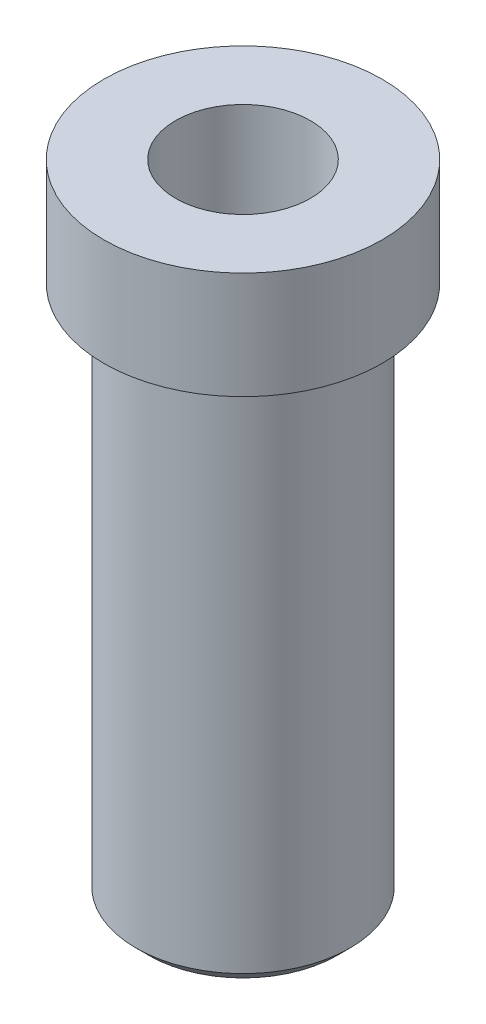
ISO-10303-21;
HEADER;
FILE_DESCRIPTION(('STEP AP214'),'2;1');
FILE_NAME('part.step','',(''),(''),'','','');
FILE_SCHEMA(('AUTOMOTIVE_DESIGN { 1 0 10303 214 1 1 1 1 }'));
ENDSEC;
DATA;
#1=APPLICATION_CONTEXT('core data for automotive mechanical design processes');
#2=APPLICATION_PROTOCOL_DEFINITION('international standard','automotive_design',2000,#1);
#3=PRODUCT_CONTEXT('',#1,'mechanical');
#4=PRODUCT('Part','Part','',(#3));
#5=PRODUCT_RELATED_PRODUCT_CATEGORY('part','',(#4));
#6=PRODUCT_DEFINITION_FORMATION('','',#4);
#7=PRODUCT_DEFINITION_CONTEXT('part definition',#1,'design');
#8=PRODUCT_DEFINITION('design','',#6,#7);
#9=PRODUCT_DEFINITION_SHAPE('','',#8);
#10=(LENGTH_UNIT() NAMED_UNIT(*) SI_UNIT(.MILLI.,.METRE.));
#11=(NAMED_UNIT(*) PLANE_ANGLE_UNIT() SI_UNIT($,.RADIAN.));
#12=(NAMED_UNIT(*) SI_UNIT($,.STERADIAN.) SOLID_ANGLE_UNIT());
#13=UNCERTAINTY_MEASURE_WITH_UNIT(LENGTH_MEASURE(1.E-05),#10,'distance_accuracy_value','');
#14=(GEOMETRIC_REPRESENTATION_CONTEXT(3) GLOBAL_UNCERTAINTY_ASSIGNED_CONTEXT((#13)) GLOBAL_UNIT_ASSIGNED_CONTEXT((#10,
#11,#12)) REPRESENTATION_CONTEXT('',''));
#15=CARTESIAN_POINT('',(0.,0.,0.));
#16=DIRECTION('',(0.,0.,1.));
#17=DIRECTION('',(1.,0.,0.));
#18=AXIS2_PLACEMENT_3D('',#15,#16,#17);
#19=CARTESIAN_POINT('',(8.00100000000001,-38.1,0.));
#20=DIRECTION('',(0.,1.,0.));
#21=DIRECTION('',(-1.,0.,0.));
#22=AXIS2_PLACEMENT_3D('',#19,#20,#21);
#23=PLANE('',#22);
#24=CARTESIAN_POINT('',(0.,-38.1,0.));
#25=DIRECTION('',(0.,1.,0.));
#26=DIRECTION('',(-1.,0.,0.));
#27=AXIS2_PLACEMENT_3D('',#24,#25,#26);
#28=CIRCLE('',#27,11.176);
#29=CARTESIAN_POINT('',(-11.1759999999999,-38.1,0.));
#30=VERTEX_POINT('',#29);
#31=EDGE_CURVE('E10',#30,#30,#28,.F.);
#32=ORIENTED_EDGE('',*,*,#31,.T.);
#33=EDGE_LOOP('',(#32));
#34=FACE_BOUND('',#33,.T.);
#35=CARTESIAN_POINT('',(0.,-38.1,0.));
#36=DIRECTION('',(0.,1.,0.));
#37=DIRECTION('',(-1.,0.,0.));
#38=AXIS2_PLACEMENT_3D('',#35,#36,#37);
#39=CIRCLE('',#38,8.001);
#40=CARTESIAN_POINT('',(-8.00099999999999,-38.1,0.));
#41=VERTEX_POINT('',#40);
#42=EDGE_CURVE('E78',#41,#41,#39,.T.);
#43=ORIENTED_EDGE('',*,*,#42,.T.);
#44=EDGE_LOOP('',(#43));
#45=FACE_BOUND('',#44,.T.);
#46=ADVANCED_FACE('F45',(#34,#45),#23,.F.);
#47=CARTESIAN_POINT('',(0.,38.1,0.));
#48=DIRECTION('',(0.,1.,0.));
#49=DIRECTION('',(-1.,0.,0.));
#50=AXIS2_PLACEMENT_3D('',#47,#48,#49);
#51=CYLINDRICAL_SURFACE('',#50,12.7);
#52=CARTESIAN_POINT('',(0.,-36.576,0.));
#53=DIRECTION('',(0.,1.,0.));
#54=DIRECTION('',(-1.,0.,0.));
#55=AXIS2_PLACEMENT_3D('',#52,#53,#54);
#56=CIRCLE('',#55,12.7);
#57=CARTESIAN_POINT('',(-12.7,-36.576,0.));
#58=VERTEX_POINT('',#57);
#59=EDGE_CURVE('E54',#58,#58,#56,.T.);
#60=ORIENTED_EDGE('',*,*,#59,.T.);
#61=EDGE_LOOP('',(#60));
#62=FACE_BOUND('',#61,.T.);
#63=CARTESIAN_POINT('',(0.,25.4,0.));
#64=DIRECTION('',(0.,1.,0.));
#65=DIRECTION('',(-1.,0.,0.));
#66=AXIS2_PLACEMENT_3D('',#63,#64,#65);
#67=CIRCLE('',#66,12.7);
#68=CARTESIAN_POINT('',(-12.7,25.4,0.));
#69=VERTEX_POINT('',#68);
#70=EDGE_CURVE('E59',#69,#69,#67,.T.);
#71=ORIENTED_EDGE('',*,*,#70,.F.);
#72=EDGE_LOOP('',(#71));
#73=FACE_BOUND('',#72,.T.);
#74=ADVANCED_FACE('F105',(#62,#73),#51,.T.);
#75=CARTESIAN_POINT('',(12.7,25.4,0.));
#76=DIRECTION('',(0.,1.,0.));
#77=DIRECTION('',(-1.,0.,0.));
#78=AXIS2_PLACEMENT_3D('',#75,#76,#77);
#79=PLANE('',#78);
#80=CARTESIAN_POINT('',(0.,25.4,0.));
#81=DIRECTION('',(0.,1.,0.));
#82=DIRECTION('',(-1.,0.,0.));
#83=AXIS2_PLACEMENT_3D('',#80,#81,#82);
#84=CIRCLE('',#83,16.51);
#85=CARTESIAN_POINT('',(-16.51,25.4,0.));
#86=VERTEX_POINT('',#85);
#87=EDGE_CURVE('E64',#86,#86,#84,.T.);
#88=ORIENTED_EDGE('',*,*,#87,.F.);
#89=EDGE_LOOP('',(#88));
#90=FACE_BOUND('',#89,.T.);
#91=ORIENTED_EDGE('',*,*,#70,.T.);
#92=EDGE_LOOP('',(#91));
#93=FACE_BOUND('',#92,.T.);
#94=ADVANCED_FACE('F99',(#90,#93),#79,.F.);
#95=CARTESIAN_POINT('',(0.,38.1,0.));
#96=DIRECTION('',(0.,1.,0.));
#97=DIRECTION('',(-1.,0.,0.));
#98=AXIS2_PLACEMENT_3D('',#95,#96,#97);
#99=CYLINDRICAL_SURFACE('',#98,16.51);
#100=CARTESIAN_POINT('',(0.,38.1,0.));
#101=DIRECTION('',(0.,1.,0.));
#102=DIRECTION('',(-1.,0.,0.));
#103=AXIS2_PLACEMENT_3D('',#100,#101,#102);
#104=CIRCLE('',#103,16.51);
#105=CARTESIAN_POINT('',(-16.51,38.1,0.));
#106=VERTEX_POINT('',#105);
#107=EDGE_CURVE('E70',#106,#106,#104,.T.);
#108=ORIENTED_EDGE('',*,*,#107,.F.);
#109=EDGE_LOOP('',(#108));
#110=FACE_BOUND('',#109,.T.);
#111=ORIENTED_EDGE('',*,*,#87,.T.);
#112=EDGE_LOOP('',(#111));
#113=FACE_BOUND('',#112,.T.);
#114=ADVANCED_FACE('F93',(#110,#113),#99,.T.);
#115=CARTESIAN_POINT('',(16.51,38.1,0.));
#116=DIRECTION('',(0.,-1.,0.));
#117=DIRECTION('',(1.,0.,0.));
#118=AXIS2_PLACEMENT_3D('',#115,#116,#117);
#119=PLANE('',#118);
#120=CARTESIAN_POINT('',(0.,38.1,0.));
#121=DIRECTION('',(0.,1.,0.));
#122=DIRECTION('',(-1.,0.,0.));
#123=AXIS2_PLACEMENT_3D('',#120,#121,#122);
#124=CIRCLE('',#123,8.001);
#125=CARTESIAN_POINT('',(-8.001,38.1,0.));
#126=VERTEX_POINT('',#125);
#127=EDGE_CURVE('E74',#126,#126,#124,.T.);
#128=ORIENTED_EDGE('',*,*,#127,.F.);
#129=EDGE_LOOP('',(#128));
#130=FACE_BOUND('',#129,.T.);
#131=ORIENTED_EDGE('',*,*,#107,.T.);
#132=EDGE_LOOP('',(#131));
#133=FACE_BOUND('',#132,.T.);
#134=ADVANCED_FACE('F87',(#130,#133),#119,.F.);
#135=CARTESIAN_POINT('',(0.,38.1,0.));
#136=DIRECTION('',(0.,1.,0.));
#137=DIRECTION('',(-1.,0.,0.));
#138=AXIS2_PLACEMENT_3D('',#135,#136,#137);
#139=CYLINDRICAL_SURFACE('',#138,8.001);
#140=ORIENTED_EDGE('',*,*,#42,.F.);
#141=EDGE_LOOP('',(#140));
#142=FACE_BOUND('',#141,.T.);
#143=ORIENTED_EDGE('',*,*,#127,.T.);
#144=EDGE_LOOP('',(#143));
#145=FACE_BOUND('',#144,.T.);
#146=ADVANCED_FACE('F84',(#142,#145),#139,.F.);
#147=CARTESIAN_POINT('',(0.,-36.576,0.));
#148=DIRECTION('',(0.,1.,0.));
#149=DIRECTION('',(-1.,0.,0.));
#150=AXIS2_PLACEMENT_3D('',#147,#148,#149);
#151=CONICAL_SURFACE('',#150,12.7,0.785398163397451);
#152=CARTESIAN_POINT('',(-11.1759999999999,-38.1,0.));
#153=CARTESIAN_POINT('',(-11.1918749999999,-38.084125,0.));
#154=CARTESIAN_POINT('',(-11.2077499999999,-38.06825,0.));
#155=CARTESIAN_POINT('',(-11.2394999999999,-38.0365,0.));
#156=CARTESIAN_POINT('',(-11.2553749999999,-38.020625,0.));
#157=CARTESIAN_POINT('',(-11.2871249999999,-37.988875,0.));
#158=CARTESIAN_POINT('',(-11.303,-37.973,0.));
#159=CARTESIAN_POINT('',(-11.3347499999999,-37.94125,0.));
#160=CARTESIAN_POINT('',(-11.350625,-37.925375,0.));
#161=CARTESIAN_POINT('',(-11.382375,-37.893625,0.));
#162=CARTESIAN_POINT('',(-11.39825,-37.87775,0.));
#163=CARTESIAN_POINT('',(-11.43,-37.846,0.));
#164=CARTESIAN_POINT('',(-11.445875,-37.830125,0.));
#165=CARTESIAN_POINT('',(-11.477625,-37.798375,0.));
#166=CARTESIAN_POINT('',(-11.4935,-37.7825,0.));
#167=CARTESIAN_POINT('',(-11.52525,-37.75075,0.));
#168=CARTESIAN_POINT('',(-11.541125,-37.734875,0.));
#169=CARTESIAN_POINT('',(-11.572875,-37.703125,0.));
#170=CARTESIAN_POINT('',(-11.58875,-37.68725,0.));
#171=CARTESIAN_POINT('',(-11.6205,-37.6555,0.));
#172=CARTESIAN_POINT('',(-11.636375,-37.639625,0.));
#173=CARTESIAN_POINT('',(-11.668125,-37.607875,0.));
#174=CARTESIAN_POINT('',(-11.684,-37.592,0.));
#175=CARTESIAN_POINT('',(-11.71575,-37.56025,0.));
#176=CARTESIAN_POINT('',(-11.731625,-37.544375,0.));
#177=CARTESIAN_POINT('',(-11.763375,-37.512625,0.));
#178=CARTESIAN_POINT('',(-11.77925,-37.49675,0.));
#179=CARTESIAN_POINT('',(-11.811,-37.465,0.));
#180=CARTESIAN_POINT('',(-11.826875,-37.449125,0.));
#181=CARTESIAN_POINT('',(-11.858625,-37.417375,0.));
#182=CARTESIAN_POINT('',(-11.8745,-37.4015,0.));
#183=CARTESIAN_POINT('',(-11.90625,-37.36975,0.));
#184=CARTESIAN_POINT('',(-11.922125,-37.353875,0.));
#185=CARTESIAN_POINT('',(-11.953875,-37.322125,0.));
#186=CARTESIAN_POINT('',(-11.96975,-37.30625,0.));
#187=CARTESIAN_POINT('',(-12.0015,-37.2745,0.));
#188=CARTESIAN_POINT('',(-12.017375,-37.258625,0.));
#189=CARTESIAN_POINT('',(-12.049125,-37.226875,0.));
#190=CARTESIAN_POINT('',(-12.065,-37.211,0.));
#191=CARTESIAN_POINT('',(-12.09675,-37.17925,0.));
#192=CARTESIAN_POINT('',(-12.112625,-37.163375,0.));
#193=CARTESIAN_POINT('',(-12.144375,-37.131625,0.));
#194=CARTESIAN_POINT('',(-12.16025,-37.11575,0.));
#195=CARTESIAN_POINT('',(-12.192,-37.084,0.));
#196=CARTESIAN_POINT('',(-12.207875,-37.068125,0.));
#197=CARTESIAN_POINT('',(-12.239625,-37.036375,0.));
#198=CARTESIAN_POINT('',(-12.2555,-37.0205,0.));
#199=CARTESIAN_POINT('',(-12.28725,-36.98875,0.));
#200=CARTESIAN_POINT('',(-12.303125,-36.972875,0.));
#201=CARTESIAN_POINT('',(-12.334875,-36.941125,0.));
#202=CARTESIAN_POINT('',(-12.35075,-36.92525,0.));
#203=CARTESIAN_POINT('',(-12.3825,-36.8935,0.));
#204=CARTESIAN_POINT('',(-12.398375,-36.877625,0.));
#205=CARTESIAN_POINT('',(-12.430125,-36.845875,0.));
#206=CARTESIAN_POINT('',(-12.446,-36.83,0.));
#207=CARTESIAN_POINT('',(-12.47775,-36.79825,0.));
#208=CARTESIAN_POINT('',(-12.493625,-36.782375,0.));
#209=CARTESIAN_POINT('',(-12.525375,-36.750625,0.));
#210=CARTESIAN_POINT('',(-12.54125,-36.73475,0.));
#211=CARTESIAN_POINT('',(-12.573,-36.703,0.));
#212=CARTESIAN_POINT('',(-12.588875,-36.687125,0.));
#213=CARTESIAN_POINT('',(-12.620625,-36.655375,0.));
#214=CARTESIAN_POINT('',(-12.6365,-36.6395,0.));
#215=CARTESIAN_POINT('',(-12.66825,-36.60775,0.));
#216=CARTESIAN_POINT('',(-12.684125,-36.591875,0.));
#217=CARTESIAN_POINT('',(-12.7,-36.576,0.));
#218=B_SPLINE_CURVE_WITH_KNOTS('',3,(#152,#153,#154,#155,#156,#157,#158,#159,#160,#161,#162,
#163,#164,#165,#166,#167,#168,#169,#170,#171,#172,#173,#174,#175,#176,#177,#178,#179,#180,#181,
#182,#183,#184,#185,#186,#187,#188,#189,#190,#191,#192,#193,#194,#195,#196,#197,#198,#199,#200,
#201,#202,#203,#204,#205,#206,#207,#208,#209,#210,#211,#212,#213,#214,#215,#216,#217),
.UNSPECIFIED.,.F.,.F.,(4,2,2,2,2,2,2,2,2,2,2,2,2,2,2,2,2,2,2,2,2,2,2,2,2,2,2,2,2,2,2,2,4),(0.,
0.0673519209080161,0.134703841816037,0.202055762724059,0.26940768363208,0.336759604540096,
0.404111525448117,0.47146344635614,0.538815367264161,0.606167288172182,0.673519209080198,
0.74087112998822,0.808223050896241,0.875574971804262,0.942926892712278,1.0102788136203,
1.07763073452832,1.14498265543634,1.21233457634436,1.27968649725238,1.3470384181604,
1.41439033906842,1.48174225997644,1.54909418088446,1.61644610179248,1.6837980227005,
1.75114994360852,1.81850186451655,1.88585378542456,1.95320570633258,2.0205576272406,
2.08790954814863,2.15526146905665),.UNSPECIFIED.);
#219=EDGE_CURVE('BSEAM48',#30,#58,#218,.T.);
#220=ORIENTED_EDGE('',*,*,#31,.F.);
#221=ORIENTED_EDGE('',*,*,#59,.F.);
#222=ORIENTED_EDGE('',*,*,#219,.T.);
#223=ORIENTED_EDGE('',*,*,#219,.F.);
#224=EDGE_LOOP('',(#220,#222,#221,#223));
#225=FACE_BOUND('',#224,.T.);
#226=ADVANCED_FACE('F48',(#225),#151,.T.);
#227=CLOSED_SHELL('',(#46,#74,#94,#114,#134,#146,#226));
#228=MANIFOLD_SOLID_BREP('B2',#227);
#229=ADVANCED_BREP_SHAPE_REPRESENTATION('',(#18,#228),#14);
#230=SHAPE_DEFINITION_REPRESENTATION(#9,#229);
ENDSEC;
END-ISO-10303-21;
